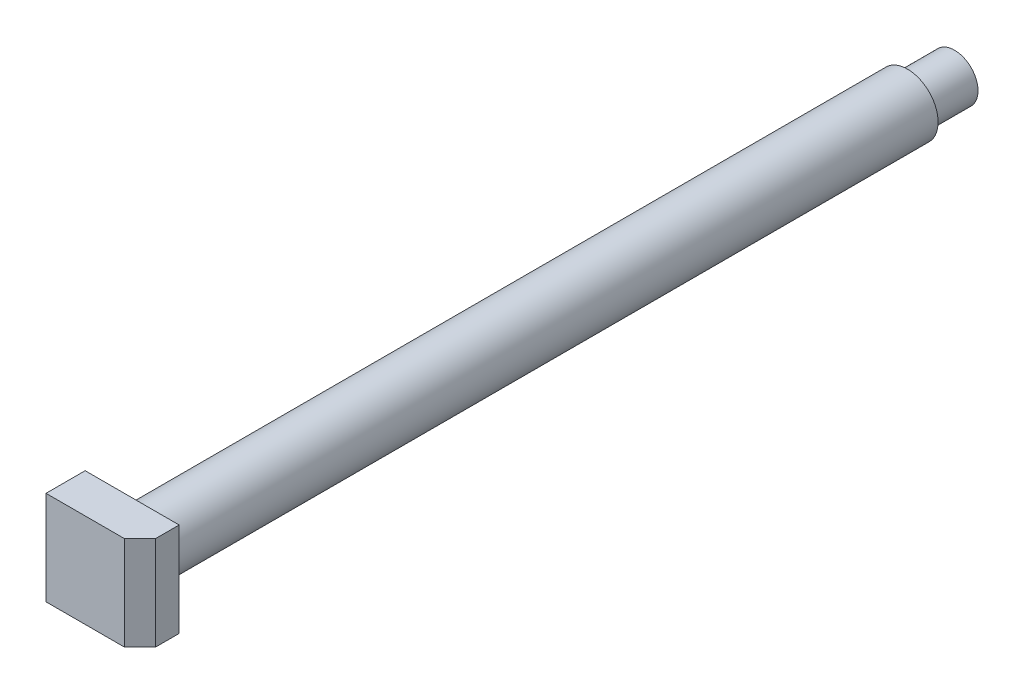
ISO-10303-21;
HEADER;
FILE_DESCRIPTION(('STEP AP214'),'2;1');
FILE_NAME('part.step','',(''),(''),'','','');
FILE_SCHEMA(('AUTOMOTIVE_DESIGN { 1 0 10303 214 1 1 1 1 }'));
ENDSEC;
DATA;
#1=APPLICATION_CONTEXT('core data for automotive mechanical design processes');
#2=APPLICATION_PROTOCOL_DEFINITION('international standard','automotive_design',2000,#1);
#3=PRODUCT_CONTEXT('',#1,'mechanical');
#4=PRODUCT('Part','Part','',(#3));
#5=PRODUCT_RELATED_PRODUCT_CATEGORY('part','',(#4));
#6=PRODUCT_DEFINITION_FORMATION('','',#4);
#7=PRODUCT_DEFINITION_CONTEXT('part definition',#1,'design');
#8=PRODUCT_DEFINITION('design','',#6,#7);
#9=PRODUCT_DEFINITION_SHAPE('','',#8);
#10=(LENGTH_UNIT() NAMED_UNIT(*) SI_UNIT(.MILLI.,.METRE.));
#11=(NAMED_UNIT(*) PLANE_ANGLE_UNIT() SI_UNIT($,.RADIAN.));
#12=(NAMED_UNIT(*) SI_UNIT($,.STERADIAN.) SOLID_ANGLE_UNIT());
#13=UNCERTAINTY_MEASURE_WITH_UNIT(LENGTH_MEASURE(1.E-05),#10,'distance_accuracy_value','');
#14=(GEOMETRIC_REPRESENTATION_CONTEXT(3) GLOBAL_UNCERTAINTY_ASSIGNED_CONTEXT((#13)) GLOBAL_UNIT_ASSIGNED_CONTEXT((#10,
#11,#12)) REPRESENTATION_CONTEXT('',''));
#15=CARTESIAN_POINT('',(0.,0.,0.));
#16=DIRECTION('',(0.,0.,1.));
#17=DIRECTION('',(1.,0.,0.));
#18=AXIS2_PLACEMENT_3D('',#15,#16,#17);
#19=CARTESIAN_POINT('',(-68.2756519863315,-15.5806201353344,105.));
#20=DIRECTION('',(0.,0.,-1.));
#21=DIRECTION('',(-1.,0.,0.));
#22=AXIS2_PLACEMENT_3D('',#19,#20,#21);
#23=CYLINDRICAL_SURFACE('',#22,3.9);
#24=CARTESIAN_POINT('',(-68.2756519863315,-15.5806201353344,105.));
#25=DIRECTION('',(0.,0.,1.));
#26=DIRECTION('',(1.,0.,0.));
#27=AXIS2_PLACEMENT_3D('',#24,#25,#26);
#28=CIRCLE('',#27,3.9);
#29=CARTESIAN_POINT('',(-64.3756519863315,-15.5806201353344,105.));
#30=VERTEX_POINT('',#29);
#31=EDGE_CURVE('E119',#30,#30,#28,.T.);
#32=ORIENTED_EDGE('',*,*,#31,.F.);
#33=EDGE_LOOP('',(#32));
#34=FACE_BOUND('',#33,.T.);
#35=CARTESIAN_POINT('',(-68.2756519863315,-15.5806201353344,6.));
#36=DIRECTION('',(0.,0.,-1.));
#37=DIRECTION('',(-1.,0.,0.));
#38=AXIS2_PLACEMENT_3D('',#35,#36,#37);
#39=CIRCLE('',#38,3.9);
#40=CARTESIAN_POINT('',(-72.1756519863315,-15.5806201353344,6.));
#41=VERTEX_POINT('',#40);
#42=EDGE_CURVE('E110',#41,#41,#39,.T.);
#43=ORIENTED_EDGE('',*,*,#42,.F.);
#44=EDGE_LOOP('',(#43));
#45=FACE_BOUND('',#44,.T.);
#46=ADVANCED_FACE('F33',(#34,#45),#23,.T.);
#47=CARTESIAN_POINT('',(-62.2756519863316,-21.5806201353344,110.));
#48=DIRECTION('',(-1.,0.,0.));
#49=DIRECTION('',(0.,0.,1.));
#50=AXIS2_PLACEMENT_3D('',#47,#48,#49);
#51=PLANE('',#50);
#52=DIRECTION('',(0.,0.,-1.));
#53=VECTOR('',#52,1.);
#54=CARTESIAN_POINT('',(-62.2756519863316,-9.58062013533441,110.));
#55=LINE('',#54,#53);
#56=CARTESIAN_POINT('',(-62.2756519863316,-9.58062013533441,108.));
#57=VERTEX_POINT('',#56);
#58=CARTESIAN_POINT('',(-62.2756519863316,-9.58062013533441,105.));
#59=VERTEX_POINT('',#58);
#60=EDGE_CURVE('E95',#57,#59,#55,.T.);
#61=ORIENTED_EDGE('',*,*,#60,.F.);
#62=DIRECTION('',(0.,-1.,0.));
#63=VECTOR('',#62,1.);
#64=CARTESIAN_POINT('',(-62.2756519863316,-21.5806201353344,108.));
#65=LINE('',#64,#63);
#66=CARTESIAN_POINT('',(-62.2756519863316,-21.5806201353344,108.));
#67=VERTEX_POINT('',#66);
#68=EDGE_CURVE('E41',#57,#67,#65,.T.);
#69=ORIENTED_EDGE('',*,*,#68,.T.);
#70=DIRECTION('',(0.,0.,-1.));
#71=VECTOR('',#70,1.);
#72=CARTESIAN_POINT('',(-62.2756519863316,-21.5806201353344,110.));
#73=LINE('',#72,#71);
#74=CARTESIAN_POINT('',(-62.2756519863316,-21.5806201353344,105.));
#75=VERTEX_POINT('',#74);
#76=EDGE_CURVE('E103',#67,#75,#73,.T.);
#77=ORIENTED_EDGE('',*,*,#76,.T.);
#78=DIRECTION('',(0.,1.,0.));
#79=VECTOR('',#78,1.);
#80=CARTESIAN_POINT('',(-62.2756519863316,-21.5806201353344,105.));
#81=LINE('',#80,#79);
#82=EDGE_CURVE('E107',#75,#59,#81,.T.);
#83=ORIENTED_EDGE('',*,*,#82,.T.);
#84=EDGE_LOOP('',(#61,#69,#77,#83));
#85=FACE_BOUND('',#84,.T.);
#86=ADVANCED_FACE('F130',(#85),#51,.F.);
#87=CARTESIAN_POINT('',(-74.2756519863314,-9.58062013533441,110.));
#88=DIRECTION('',(0.,-1.,0.));
#89=DIRECTION('',(0.,0.,-1.));
#90=AXIS2_PLACEMENT_3D('',#87,#88,#89);
#91=PLANE('',#90);
#92=DIRECTION('',(-1.,0.,0.));
#93=VECTOR('',#92,1.);
#94=CARTESIAN_POINT('',(-74.2756519863314,-9.58062013533441,110.));
#95=LINE('',#94,#93);
#96=CARTESIAN_POINT('',(-64.2756519863316,-9.58062013533441,110.));
#97=VERTEX_POINT('',#96);
#98=CARTESIAN_POINT('',(-74.2756519863314,-9.58062013533441,110.));
#99=VERTEX_POINT('',#98);
#100=EDGE_CURVE('E77',#97,#99,#95,.T.);
#101=ORIENTED_EDGE('',*,*,#100,.F.);
#102=DIRECTION('',(-0.707106781186544,0.,0.707106781186551));
#103=VECTOR('',#102,1.);
#104=CARTESIAN_POINT('',(-64.2756519863316,-9.58062013533441,110.));
#105=LINE('',#104,#103);
#106=EDGE_CURVE('E55',#97,#57,#105,.F.);
#107=ORIENTED_EDGE('',*,*,#106,.T.);
#108=ORIENTED_EDGE('',*,*,#60,.T.);
#109=DIRECTION('',(-1.,0.,0.));
#110=VECTOR('',#109,1.);
#111=CARTESIAN_POINT('',(-74.2756519863314,-9.58062013533441,105.));
#112=LINE('',#111,#110);
#113=CARTESIAN_POINT('',(-74.2756519863314,-9.58062013533441,105.));
#114=VERTEX_POINT('',#113);
#115=EDGE_CURVE('E92',#59,#114,#112,.T.);
#116=ORIENTED_EDGE('',*,*,#115,.T.);
#117=DIRECTION('',(0.,0.,-1.));
#118=VECTOR('',#117,1.);
#119=CARTESIAN_POINT('',(-74.2756519863314,-9.58062013533441,110.));
#120=LINE('',#119,#118);
#121=EDGE_CURVE('E89',#99,#114,#120,.T.);
#122=ORIENTED_EDGE('',*,*,#121,.F.);
#123=EDGE_LOOP('',(#101,#107,#108,#116,#122));
#124=FACE_BOUND('',#123,.T.);
#125=ADVANCED_FACE('F90',(#124),#91,.F.);
#126=CARTESIAN_POINT('',(-74.2756519863314,-21.5806201353344,110.));
#127=DIRECTION('',(1.,0.,0.));
#128=DIRECTION('',(0.,0.,-1.));
#129=AXIS2_PLACEMENT_3D('',#126,#127,#128);
#130=PLANE('',#129);
#131=DIRECTION('',(0.,-1.,0.));
#132=VECTOR('',#131,1.);
#133=CARTESIAN_POINT('',(-74.2756519863314,-21.5806201353344,105.));
#134=LINE('',#133,#132);
#135=CARTESIAN_POINT('',(-74.2756519863314,-21.5806201353344,105.));
#136=VERTEX_POINT('',#135);
#137=EDGE_CURVE('E112',#114,#136,#134,.T.);
#138=ORIENTED_EDGE('',*,*,#137,.T.);
#139=DIRECTION('',(0.,0.,-1.));
#140=VECTOR('',#139,1.);
#141=CARTESIAN_POINT('',(-74.2756519863314,-21.5806201353344,110.));
#142=LINE('',#141,#140);
#143=CARTESIAN_POINT('',(-74.2756519863314,-21.5806201353344,110.));
#144=VERTEX_POINT('',#143);
#145=EDGE_CURVE('E96',#144,#136,#142,.T.);
#146=ORIENTED_EDGE('',*,*,#145,.F.);
#147=DIRECTION('',(0.,-1.,0.));
#148=VECTOR('',#147,1.);
#149=CARTESIAN_POINT('',(-74.2756519863314,-21.5806201353344,110.));
#150=LINE('',#149,#148);
#151=EDGE_CURVE('E82',#99,#144,#150,.T.);
#152=ORIENTED_EDGE('',*,*,#151,.F.);
#153=ORIENTED_EDGE('',*,*,#121,.T.);
#154=EDGE_LOOP('',(#138,#146,#152,#153));
#155=FACE_BOUND('',#154,.T.);
#156=ADVANCED_FACE('F98',(#155),#130,.F.);
#157=CARTESIAN_POINT('',(-74.2756519863314,-21.5806201353344,110.));
#158=DIRECTION('',(0.,1.,0.));
#159=DIRECTION('',(0.,0.,1.));
#160=AXIS2_PLACEMENT_3D('',#157,#158,#159);
#161=PLANE('',#160);
#162=ORIENTED_EDGE('',*,*,#76,.F.);
#163=DIRECTION('',(0.707106781186544,0.,-0.707106781186551));
#164=VECTOR('',#163,1.);
#165=CARTESIAN_POINT('',(-64.2756519863316,-21.5806201353344,110.));
#166=LINE('',#165,#164);
#167=CARTESIAN_POINT('',(-64.2756519863316,-21.5806201353344,110.));
#168=VERTEX_POINT('',#167);
#169=EDGE_CURVE('E11',#67,#168,#166,.F.);
#170=ORIENTED_EDGE('',*,*,#169,.T.);
#171=DIRECTION('',(1.,0.,0.));
#172=VECTOR('',#171,1.);
#173=CARTESIAN_POINT('',(-74.2756519863314,-21.5806201353344,110.));
#174=LINE('',#173,#172);
#175=EDGE_CURVE('E101',#144,#168,#174,.T.);
#176=ORIENTED_EDGE('',*,*,#175,.F.);
#177=ORIENTED_EDGE('',*,*,#145,.T.);
#178=DIRECTION('',(1.,0.,0.));
#179=VECTOR('',#178,1.);
#180=CARTESIAN_POINT('',(-74.2756519863314,-21.5806201353344,105.));
#181=LINE('',#180,#179);
#182=EDGE_CURVE('E86',#136,#75,#181,.T.);
#183=ORIENTED_EDGE('',*,*,#182,.T.);
#184=EDGE_LOOP('',(#162,#170,#176,#177,#183));
#185=FACE_BOUND('',#184,.T.);
#186=ADVANCED_FACE('F173',(#185),#161,.F.);
#187=CARTESIAN_POINT('',(0.,0.,110.));
#188=DIRECTION('',(0.,0.,-1.));
#189=DIRECTION('',(-1.,0.,0.));
#190=AXIS2_PLACEMENT_3D('',#187,#188,#189);
#191=PLANE('',#190);
#192=ORIENTED_EDGE('',*,*,#175,.T.);
#193=DIRECTION('',(0.,1.,0.));
#194=VECTOR('',#193,1.);
#195=CARTESIAN_POINT('',(-64.2756519863316,0.,110.));
#196=LINE('',#195,#194);
#197=EDGE_CURVE('E85',#168,#97,#196,.T.);
#198=ORIENTED_EDGE('',*,*,#197,.T.);
#199=ORIENTED_EDGE('',*,*,#100,.T.);
#200=ORIENTED_EDGE('',*,*,#151,.T.);
#201=EDGE_LOOP('',(#192,#198,#199,#200));
#202=FACE_BOUND('',#201,.T.);
#203=ADVANCED_FACE('F80',(#202),#191,.F.);
#204=CARTESIAN_POINT('',(0.,0.,105.));
#205=DIRECTION('',(0.,0.,-1.));
#206=DIRECTION('',(-1.,0.,0.));
#207=AXIS2_PLACEMENT_3D('',#204,#205,#206);
#208=PLANE('',#207);
#209=ORIENTED_EDGE('',*,*,#31,.T.);
#210=EDGE_LOOP('',(#209));
#211=FACE_BOUND('',#210,.T.);
#212=ORIENTED_EDGE('',*,*,#82,.F.);
#213=ORIENTED_EDGE('',*,*,#182,.F.);
#214=ORIENTED_EDGE('',*,*,#137,.F.);
#215=ORIENTED_EDGE('',*,*,#115,.F.);
#216=EDGE_LOOP('',(#212,#213,#214,#215));
#217=FACE_BOUND('',#216,.T.);
#218=ADVANCED_FACE('F125',(#211,#217),#208,.T.);
#219=CARTESIAN_POINT('',(-68.2756519863315,-15.5806201353344,6.));
#220=DIRECTION('',(0.,0.,-1.));
#221=DIRECTION('',(-1.,0.,0.));
#222=AXIS2_PLACEMENT_3D('',#219,#220,#221);
#223=PLANE('',#222);
#224=CARTESIAN_POINT('',(-68.2756519863315,-15.5806201353344,6.));
#225=DIRECTION('',(0.,0.,-1.));
#226=DIRECTION('',(-1.,0.,0.));
#227=AXIS2_PLACEMENT_3D('',#224,#225,#226);
#228=CIRCLE('',#227,3.00000000000001);
#229=CARTESIAN_POINT('',(-71.2756519863315,-15.5806201353344,6.));
#230=VERTEX_POINT('',#229);
#231=EDGE_CURVE('E134',#230,#230,#228,.T.);
#232=ORIENTED_EDGE('',*,*,#231,.F.);
#233=EDGE_LOOP('',(#232));
#234=FACE_BOUND('',#233,.T.);
#235=ORIENTED_EDGE('',*,*,#42,.T.);
#236=EDGE_LOOP('',(#235));
#237=FACE_BOUND('',#236,.T.);
#238=ADVANCED_FACE('F158',(#234,#237),#223,.T.);
#239=CARTESIAN_POINT('',(-68.2756519863315,-15.5806201353344,6.));
#240=DIRECTION('',(0.,0.,-1.));
#241=DIRECTION('',(-1.,0.,0.));
#242=AXIS2_PLACEMENT_3D('',#239,#240,#241);
#243=CYLINDRICAL_SURFACE('',#242,3.00000000000001);
#244=ORIENTED_EDGE('',*,*,#231,.T.);
#245=EDGE_LOOP('',(#244));
#246=FACE_BOUND('',#245,.T.);
#247=CARTESIAN_POINT('',(-68.2756519863315,-15.5806201353344,0.));
#248=DIRECTION('',(0.,0.,-1.));
#249=DIRECTION('',(-1.,0.,0.));
#250=AXIS2_PLACEMENT_3D('',#247,#248,#249);
#251=CIRCLE('',#250,3.00000000000001);
#252=CARTESIAN_POINT('',(-71.2756519863315,-15.5806201353344,0.));
#253=VERTEX_POINT('',#252);
#254=EDGE_CURVE('E136',#253,#253,#251,.T.);
#255=ORIENTED_EDGE('',*,*,#254,.F.);
#256=EDGE_LOOP('',(#255));
#257=FACE_BOUND('',#256,.T.);
#258=ADVANCED_FACE('F153',(#246,#257),#243,.T.);
#259=CARTESIAN_POINT('',(-68.2756519863315,-15.5806201353344,0.));
#260=DIRECTION('',(0.,0.,1.));
#261=DIRECTION('',(1.,0.,0.));
#262=AXIS2_PLACEMENT_3D('',#259,#260,#261);
#263=PLANE('',#262);
#264=CARTESIAN_POINT('',(-68.2756519863315,-15.5806201353344,0.));
#265=DIRECTION('',(0.,0.,-1.));
#266=DIRECTION('',(-1.,0.,0.));
#267=AXIS2_PLACEMENT_3D('',#264,#265,#266);
#268=CIRCLE('',#267,1.25);
#269=CARTESIAN_POINT('',(-69.5256519863315,-15.5806201353344,0.));
#270=VERTEX_POINT('',#269);
#271=EDGE_CURVE('E144',#270,#270,#268,.T.);
#272=ORIENTED_EDGE('',*,*,#271,.F.);
#273=EDGE_LOOP('',(#272));
#274=FACE_BOUND('',#273,.T.);
#275=ORIENTED_EDGE('',*,*,#254,.T.);
#276=EDGE_LOOP('',(#275));
#277=FACE_BOUND('',#276,.T.);
#278=ADVANCED_FACE('F150',(#274,#277),#263,.F.);
#279=CARTESIAN_POINT('',(-64.2756519863316,0.,110.));
#280=DIRECTION('',(-0.707106781186551,0.,-0.707106781186544));
#281=DIRECTION('',(0.,1.,0.));
#282=AXIS2_PLACEMENT_3D('',#279,#280,#281);
#283=PLANE('',#282);
#284=ORIENTED_EDGE('',*,*,#169,.F.);
#285=ORIENTED_EDGE('',*,*,#68,.F.);
#286=ORIENTED_EDGE('',*,*,#106,.F.);
#287=ORIENTED_EDGE('',*,*,#197,.F.);
#288=EDGE_LOOP('',(#284,#285,#286,#287));
#289=FACE_BOUND('',#288,.T.);
#290=ADVANCED_FACE('F35',(#289),#283,.F.);
#291=CARTESIAN_POINT('',(-68.2756519863315,-15.5806201353344,12.));
#292=DIRECTION('',(0.,0.,1.));
#293=DIRECTION('',(1.,0.,0.));
#294=AXIS2_PLACEMENT_3D('',#291,#292,#293);
#295=PLANE('',#294);
#296=CARTESIAN_POINT('',(-68.2756519863315,-15.5806201353344,12.));
#297=DIRECTION('',(0.,0.,-1.));
#298=DIRECTION('',(-1.,0.,0.));
#299=AXIS2_PLACEMENT_3D('',#296,#297,#298);
#300=CIRCLE('',#299,1.25);
#301=CARTESIAN_POINT('',(-69.5256519863315,-15.5806201353344,12.));
#302=VERTEX_POINT('',#301);
#303=EDGE_CURVE('E140',#302,#302,#300,.T.);
#304=ORIENTED_EDGE('',*,*,#303,.T.);
#305=EDGE_LOOP('',(#304));
#306=FACE_BOUND('',#305,.T.);
#307=ADVANCED_FACE('F168',(#306),#295,.F.);
#308=CARTESIAN_POINT('',(-68.2756519863315,-15.5806201353344,0.));
#309=DIRECTION('',(0.,0.,-1.));
#310=DIRECTION('',(-1.,0.,0.));
#311=AXIS2_PLACEMENT_3D('',#308,#309,#310);
#312=CYLINDRICAL_SURFACE('',#311,1.25);
#313=ORIENTED_EDGE('',*,*,#303,.F.);
#314=EDGE_LOOP('',(#313));
#315=FACE_BOUND('',#314,.T.);
#316=ORIENTED_EDGE('',*,*,#271,.T.);
#317=EDGE_LOOP('',(#316));
#318=FACE_BOUND('',#317,.T.);
#319=ADVANCED_FACE('F148',(#315,#318),#312,.F.);
#320=CLOSED_SHELL('',(#46,#86,#125,#156,#186,#203,#218,#238,#258,#278,#290,#307,#319));
#321=MANIFOLD_SOLID_BREP('B2',#320);
#322=ADVANCED_BREP_SHAPE_REPRESENTATION('',(#18,#321),#14);
#323=SHAPE_DEFINITION_REPRESENTATION(#9,#322);
ENDSEC;
END-ISO-10303-21;
